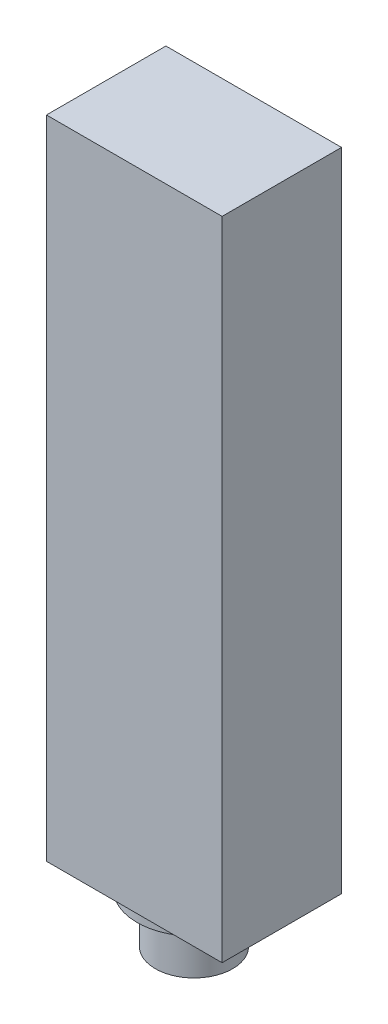
ISO-10303-21;
HEADER;
FILE_DESCRIPTION(('STEP AP214'),'2;1');
FILE_NAME('part.step','',(''),(''),'','','');
FILE_SCHEMA(('AUTOMOTIVE_DESIGN { 1 0 10303 214 1 1 1 1 }'));
ENDSEC;
DATA;
#1=APPLICATION_CONTEXT('core data for automotive mechanical design processes');
#2=APPLICATION_PROTOCOL_DEFINITION('international standard','automotive_design',2000,#1);
#3=PRODUCT_CONTEXT('',#1,'mechanical');
#4=PRODUCT('Part','Part','',(#3));
#5=PRODUCT_RELATED_PRODUCT_CATEGORY('part','',(#4));
#6=PRODUCT_DEFINITION_FORMATION('','',#4);
#7=PRODUCT_DEFINITION_CONTEXT('part definition',#1,'design');
#8=PRODUCT_DEFINITION('design','',#6,#7);
#9=PRODUCT_DEFINITION_SHAPE('','',#8);
#10=(LENGTH_UNIT() NAMED_UNIT(*) SI_UNIT(.MILLI.,.METRE.));
#11=(NAMED_UNIT(*) PLANE_ANGLE_UNIT() SI_UNIT($,.RADIAN.));
#12=(NAMED_UNIT(*) SI_UNIT($,.STERADIAN.) SOLID_ANGLE_UNIT());
#13=UNCERTAINTY_MEASURE_WITH_UNIT(LENGTH_MEASURE(1.E-05),#10,'distance_accuracy_value','');
#14=(GEOMETRIC_REPRESENTATION_CONTEXT(3) GLOBAL_UNCERTAINTY_ASSIGNED_CONTEXT((#13)) GLOBAL_UNIT_ASSIGNED_CONTEXT((#10,
#11,#12)) REPRESENTATION_CONTEXT('',''));
#15=CARTESIAN_POINT('',(0.,0.,0.));
#16=DIRECTION('',(0.,0.,1.));
#17=DIRECTION('',(1.,0.,0.));
#18=AXIS2_PLACEMENT_3D('',#15,#16,#17);
#19=CARTESIAN_POINT('',(0.,1359.,-2.52391369522792E-13));
#20=DIRECTION('',(0.,1.,0.));
#21=DIRECTION('',(1.,0.,0.));
#22=AXIS2_PLACEMENT_3D('',#19,#20,#21);
#23=PLANE('',#22);
#24=CARTESIAN_POINT('',(0.,1359.,-2.52391369522792E-13));
#25=DIRECTION('',(0.,1.,0.));
#26=DIRECTION('',(1.,0.,0.));
#27=AXIS2_PLACEMENT_3D('',#24,#25,#26);
#28=CIRCLE('',#27,55.);
#29=CARTESIAN_POINT('',(55.,1359.,-2.52391369522792E-13));
#30=VERTEX_POINT('',#29);
#31=EDGE_CURVE('E101',#30,#30,#28,.T.);
#32=ORIENTED_EDGE('',*,*,#31,.F.);
#33=EDGE_LOOP('',(#32));
#34=FACE_BOUND('',#33,.T.);
#35=CARTESIAN_POINT('',(0.,1359.,-2.47982786649031E-13));
#36=DIRECTION('',(0.,1.,0.));
#37=DIRECTION('',(0.,0.,1.));
#38=AXIS2_PLACEMENT_3D('',#35,#36,#37);
#39=CIRCLE('',#38,37.5);
#40=CARTESIAN_POINT('',(0.,1359.,37.4999999999998));
#41=VERTEX_POINT('',#40);
#42=EDGE_CURVE('E11',#41,#41,#39,.F.);
#43=ORIENTED_EDGE('',*,*,#42,.F.);
#44=EDGE_LOOP('',(#43));
#45=FACE_BOUND('',#44,.T.);
#46=ADVANCED_FACE('F17',(#34,#45),#23,.F.);
#47=CARTESIAN_POINT('',(-125.,1444.,-85.));
#48=DIRECTION('',(-1.,0.,0.));
#49=DIRECTION('',(0.,0.,-1.));
#50=AXIS2_PLACEMENT_3D('',#47,#48,#49);
#51=PLANE('',#50);
#52=DIRECTION('',(0.,0.,1.));
#53=VECTOR('',#52,1.);
#54=CARTESIAN_POINT('',(-125.,2364.,-85.));
#55=LINE('',#54,#53);
#56=CARTESIAN_POINT('',(-125.,2364.,-85.));
#57=VERTEX_POINT('',#56);
#58=CARTESIAN_POINT('',(-125.,2364.,85.));
#59=VERTEX_POINT('',#58);
#60=EDGE_CURVE('E58',#57,#59,#55,.T.);
#61=ORIENTED_EDGE('',*,*,#60,.F.);
#62=DIRECTION('',(0.,1.,0.));
#63=VECTOR('',#62,1.);
#64=CARTESIAN_POINT('',(-125.,1444.,-85.));
#65=LINE('',#64,#63);
#66=CARTESIAN_POINT('',(-125.,1444.,-85.));
#67=VERTEX_POINT('',#66);
#68=EDGE_CURVE('E32',#67,#57,#65,.T.);
#69=ORIENTED_EDGE('',*,*,#68,.F.);
#70=DIRECTION('',(0.,0.,1.));
#71=VECTOR('',#70,1.);
#72=CARTESIAN_POINT('',(-125.,1444.,-85.));
#73=LINE('',#72,#71);
#74=CARTESIAN_POINT('',(-125.,1444.,85.));
#75=VERTEX_POINT('',#74);
#76=EDGE_CURVE('E60',#67,#75,#73,.T.);
#77=ORIENTED_EDGE('',*,*,#76,.T.);
#78=DIRECTION('',(0.,1.,0.));
#79=VECTOR('',#78,1.);
#80=CARTESIAN_POINT('',(-125.,1444.,85.));
#81=LINE('',#80,#79);
#82=EDGE_CURVE('E25',#75,#59,#81,.T.);
#83=ORIENTED_EDGE('',*,*,#82,.T.);
#84=EDGE_LOOP('',(#61,#69,#77,#83));
#85=FACE_BOUND('',#84,.T.);
#86=ADVANCED_FACE('F19',(#85),#51,.T.);
#87=CARTESIAN_POINT('',(-125.,1444.,85.));
#88=DIRECTION('',(0.,0.,1.));
#89=DIRECTION('',(-1.,0.,0.));
#90=AXIS2_PLACEMENT_3D('',#87,#88,#89);
#91=PLANE('',#90);
#92=DIRECTION('',(1.,0.,0.));
#93=VECTOR('',#92,1.);
#94=CARTESIAN_POINT('',(-125.,2364.,85.));
#95=LINE('',#94,#93);
#96=CARTESIAN_POINT('',(125.,2364.,85.));
#97=VERTEX_POINT('',#96);
#98=EDGE_CURVE('E66',#59,#97,#95,.T.);
#99=ORIENTED_EDGE('',*,*,#98,.F.);
#100=ORIENTED_EDGE('',*,*,#82,.F.);
#101=DIRECTION('',(1.,0.,0.));
#102=VECTOR('',#101,1.);
#103=CARTESIAN_POINT('',(-125.,1444.,85.));
#104=LINE('',#103,#102);
#105=CARTESIAN_POINT('',(125.,1444.,85.));
#106=VERTEX_POINT('',#105);
#107=EDGE_CURVE('E84',#75,#106,#104,.T.);
#108=ORIENTED_EDGE('',*,*,#107,.T.);
#109=DIRECTION('',(0.,1.,0.));
#110=VECTOR('',#109,1.);
#111=CARTESIAN_POINT('',(125.,1444.,85.));
#112=LINE('',#111,#110);
#113=EDGE_CURVE('E64',#106,#97,#112,.T.);
#114=ORIENTED_EDGE('',*,*,#113,.T.);
#115=EDGE_LOOP('',(#99,#100,#108,#114));
#116=FACE_BOUND('',#115,.T.);
#117=ADVANCED_FACE('F67',(#116),#91,.T.);
#118=CARTESIAN_POINT('',(125.,1444.,85.));
#119=DIRECTION('',(1.,0.,0.));
#120=DIRECTION('',(0.,0.,1.));
#121=AXIS2_PLACEMENT_3D('',#118,#119,#120);
#122=PLANE('',#121);
#123=DIRECTION('',(0.,0.,-1.));
#124=VECTOR('',#123,1.);
#125=CARTESIAN_POINT('',(125.,2364.,85.));
#126=LINE('',#125,#124);
#127=CARTESIAN_POINT('',(125.,2364.,-85.));
#128=VERTEX_POINT('',#127);
#129=EDGE_CURVE('E71',#97,#128,#126,.T.);
#130=ORIENTED_EDGE('',*,*,#129,.F.);
#131=ORIENTED_EDGE('',*,*,#113,.F.);
#132=DIRECTION('',(0.,0.,-1.));
#133=VECTOR('',#132,1.);
#134=CARTESIAN_POINT('',(125.,1444.,85.));
#135=LINE('',#134,#133);
#136=CARTESIAN_POINT('',(125.,1444.,-85.));
#137=VERTEX_POINT('',#136);
#138=EDGE_CURVE('E86',#106,#137,#135,.T.);
#139=ORIENTED_EDGE('',*,*,#138,.T.);
#140=DIRECTION('',(0.,1.,0.));
#141=VECTOR('',#140,1.);
#142=CARTESIAN_POINT('',(125.,1444.,-85.));
#143=LINE('',#142,#141);
#144=EDGE_CURVE('E39',#137,#128,#143,.T.);
#145=ORIENTED_EDGE('',*,*,#144,.T.);
#146=EDGE_LOOP('',(#130,#131,#139,#145));
#147=FACE_BOUND('',#146,.T.);
#148=ADVANCED_FACE('F94',(#147),#122,.T.);
#149=CARTESIAN_POINT('',(125.,1444.,-85.));
#150=DIRECTION('',(0.,0.,-1.));
#151=DIRECTION('',(1.,0.,0.));
#152=AXIS2_PLACEMENT_3D('',#149,#150,#151);
#153=PLANE('',#152);
#154=DIRECTION('',(-1.,0.,0.));
#155=VECTOR('',#154,1.);
#156=CARTESIAN_POINT('',(125.,2364.,-85.));
#157=LINE('',#156,#155);
#158=EDGE_CURVE('E75',#128,#57,#157,.T.);
#159=ORIENTED_EDGE('',*,*,#158,.F.);
#160=ORIENTED_EDGE('',*,*,#144,.F.);
#161=DIRECTION('',(-1.,0.,0.));
#162=VECTOR('',#161,1.);
#163=CARTESIAN_POINT('',(125.,1444.,-85.));
#164=LINE('',#163,#162);
#165=EDGE_CURVE('E88',#137,#67,#164,.T.);
#166=ORIENTED_EDGE('',*,*,#165,.T.);
#167=ORIENTED_EDGE('',*,*,#68,.T.);
#168=EDGE_LOOP('',(#159,#160,#166,#167));
#169=FACE_BOUND('',#168,.T.);
#170=ADVANCED_FACE('F97',(#169),#153,.T.);
#171=CARTESIAN_POINT('',(-125.,1444.,85.));
#172=DIRECTION('',(0.,1.,0.));
#173=DIRECTION('',(0.,0.,1.));
#174=AXIS2_PLACEMENT_3D('',#171,#172,#173);
#175=PLANE('',#174);
#176=CARTESIAN_POINT('',(0.,1444.,-2.65249736237927E-13));
#177=DIRECTION('',(0.,1.,0.));
#178=DIRECTION('',(1.,0.,0.));
#179=AXIS2_PLACEMENT_3D('',#176,#177,#178);
#180=CIRCLE('',#179,81.);
#181=CARTESIAN_POINT('',(81.,1444.,-2.65249736237927E-13));
#182=VERTEX_POINT('',#181);
#183=EDGE_CURVE('E79',#182,#182,#180,.T.);
#184=ORIENTED_EDGE('',*,*,#183,.T.);
#185=EDGE_LOOP('',(#184));
#186=FACE_BOUND('',#185,.T.);
#187=ORIENTED_EDGE('',*,*,#76,.F.);
#188=ORIENTED_EDGE('',*,*,#165,.F.);
#189=ORIENTED_EDGE('',*,*,#138,.F.);
#190=ORIENTED_EDGE('',*,*,#107,.F.);
#191=EDGE_LOOP('',(#187,#188,#189,#190));
#192=FACE_BOUND('',#191,.T.);
#193=ADVANCED_FACE('F145',(#186,#192),#175,.F.);
#194=CARTESIAN_POINT('',(-125.,2364.,85.));
#195=DIRECTION('',(0.,1.,0.));
#196=DIRECTION('',(0.,0.,1.));
#197=AXIS2_PLACEMENT_3D('',#194,#195,#196);
#198=PLANE('',#197);
#199=ORIENTED_EDGE('',*,*,#60,.T.);
#200=ORIENTED_EDGE('',*,*,#98,.T.);
#201=ORIENTED_EDGE('',*,*,#129,.T.);
#202=ORIENTED_EDGE('',*,*,#158,.T.);
#203=EDGE_LOOP('',(#199,#200,#201,#202));
#204=FACE_BOUND('',#203,.T.);
#205=ADVANCED_FACE('F74',(#204),#198,.T.);
#206=CARTESIAN_POINT('',(0.,1429.,-2.65249736237927E-13));
#207=DIRECTION('',(0.,1.,0.));
#208=DIRECTION('',(1.,0.,0.));
#209=AXIS2_PLACEMENT_3D('',#206,#207,#208);
#210=CYLINDRICAL_SURFACE('',#209,81.);
#211=CARTESIAN_POINT('',(0.,1429.,-2.65249736237927E-13));
#212=DIRECTION('',(0.,1.,0.));
#213=DIRECTION('',(1.,0.,0.));
#214=AXIS2_PLACEMENT_3D('',#211,#212,#213);
#215=CIRCLE('',#214,81.);
#216=CARTESIAN_POINT('',(81.,1429.,-2.65249736237927E-13));
#217=VERTEX_POINT('',#216);
#218=EDGE_CURVE('E76',#217,#217,#215,.T.);
#219=ORIENTED_EDGE('',*,*,#218,.T.);
#220=EDGE_LOOP('',(#219));
#221=FACE_BOUND('',#220,.T.);
#222=ORIENTED_EDGE('',*,*,#183,.F.);
#223=EDGE_LOOP('',(#222));
#224=FACE_BOUND('',#223,.T.);
#225=ADVANCED_FACE('F138',(#221,#224),#210,.T.);
#226=CARTESIAN_POINT('',(0.,1429.,-2.65249736237927E-13));
#227=DIRECTION('',(0.,1.,0.));
#228=DIRECTION('',(1.,0.,0.));
#229=AXIS2_PLACEMENT_3D('',#226,#227,#228);
#230=PLANE('',#229);
#231=CARTESIAN_POINT('',(0.,1429.,-2.65249736237927E-13));
#232=DIRECTION('',(0.,1.,0.));
#233=DIRECTION('',(1.,0.,0.));
#234=AXIS2_PLACEMENT_3D('',#231,#232,#233);
#235=CIRCLE('',#234,55.);
#236=CARTESIAN_POINT('',(55.,1429.,-2.65249736237927E-13));
#237=VERTEX_POINT('',#236);
#238=EDGE_CURVE('E104',#237,#237,#235,.T.);
#239=ORIENTED_EDGE('',*,*,#238,.T.);
#240=EDGE_LOOP('',(#239));
#241=FACE_BOUND('',#240,.T.);
#242=ORIENTED_EDGE('',*,*,#218,.F.);
#243=EDGE_LOOP('',(#242));
#244=FACE_BOUND('',#243,.T.);
#245=ADVANCED_FACE('F124',(#241,#244),#230,.F.);
#246=CARTESIAN_POINT('',(0.,1359.,-2.52391369522792E-13));
#247=DIRECTION('',(0.,1.,0.));
#248=DIRECTION('',(1.,0.,0.));
#249=AXIS2_PLACEMENT_3D('',#246,#247,#248);
#250=CYLINDRICAL_SURFACE('',#249,55.);
#251=ORIENTED_EDGE('',*,*,#31,.T.);
#252=EDGE_LOOP('',(#251));
#253=FACE_BOUND('',#252,.T.);
#254=ORIENTED_EDGE('',*,*,#238,.F.);
#255=EDGE_LOOP('',(#254));
#256=FACE_BOUND('',#255,.T.);
#257=ADVANCED_FACE('F115',(#253,#256),#250,.T.);
#258=CARTESIAN_POINT('',(0.,1350.,-2.47982786649031E-13));
#259=DIRECTION('',(0.,1.,0.));
#260=DIRECTION('',(0.,0.,1.));
#261=AXIS2_PLACEMENT_3D('',#258,#259,#260);
#262=PLANE('',#261);
#263=CARTESIAN_POINT('',(0.,1350.,-2.47982786649031E-13));
#264=DIRECTION('',(0.,1.,0.));
#265=DIRECTION('',(0.,0.,1.));
#266=AXIS2_PLACEMENT_3D('',#263,#264,#265);
#267=CIRCLE('',#266,37.5);
#268=CARTESIAN_POINT('',(0.,1350.,37.4999999999998));
#269=VERTEX_POINT('',#268);
#270=EDGE_CURVE('E107',#269,#269,#267,.T.);
#271=ORIENTED_EDGE('',*,*,#270,.F.);
#272=EDGE_LOOP('',(#271));
#273=FACE_BOUND('',#272,.T.);
#274=ADVANCED_FACE('F113',(#273),#262,.F.);
#275=CARTESIAN_POINT('',(0.,1350.,-2.47982786649031E-13));
#276=DIRECTION('',(0.,1.,0.));
#277=DIRECTION('',(0.,0.,1.));
#278=AXIS2_PLACEMENT_3D('',#275,#276,#277);
#279=CYLINDRICAL_SURFACE('',#278,37.5);
#280=ORIENTED_EDGE('',*,*,#42,.T.);
#281=EDGE_LOOP('',(#280));
#282=FACE_BOUND('',#281,.T.);
#283=ORIENTED_EDGE('',*,*,#270,.T.);
#284=EDGE_LOOP('',(#283));
#285=FACE_BOUND('',#284,.T.);
#286=ADVANCED_FACE('F111',(#282,#285),#279,.T.);
#287=CLOSED_SHELL('',(#46,#86,#117,#148,#170,#193,#205,#225,#245,#257,#274,#286));
#288=MANIFOLD_SOLID_BREP('B1',#287);
#289=ADVANCED_BREP_SHAPE_REPRESENTATION('',(#18,#288),#14);
#290=SHAPE_DEFINITION_REPRESENTATION(#9,#289);
ENDSEC;
END-ISO-10303-21;
